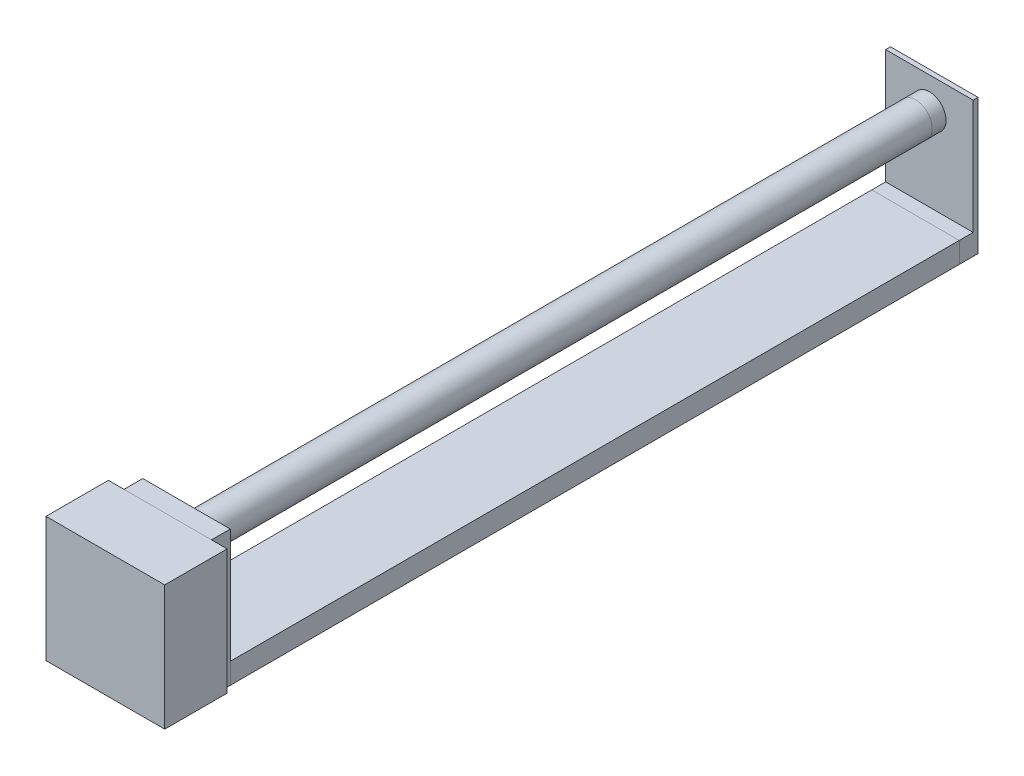
ISO-10303-21;
HEADER;
FILE_DESCRIPTION(('STEP AP214'),'2;1');
FILE_NAME('part.step','',(''),(''),'','','');
FILE_SCHEMA(('AUTOMOTIVE_DESIGN { 1 0 10303 214 1 1 1 1 }'));
ENDSEC;
DATA;
#1=APPLICATION_CONTEXT('core data for automotive mechanical design processes');
#2=APPLICATION_PROTOCOL_DEFINITION('international standard','automotive_design',2000,#1);
#3=PRODUCT_CONTEXT('',#1,'mechanical');
#4=PRODUCT('Part','Part','',(#3));
#5=PRODUCT_RELATED_PRODUCT_CATEGORY('part','',(#4));
#6=PRODUCT_DEFINITION_FORMATION('','',#4);
#7=PRODUCT_DEFINITION_CONTEXT('part definition',#1,'design');
#8=PRODUCT_DEFINITION('design','',#6,#7);
#9=PRODUCT_DEFINITION_SHAPE('','',#8);
#10=(LENGTH_UNIT() NAMED_UNIT(*) SI_UNIT(.MILLI.,.METRE.));
#11=(NAMED_UNIT(*) PLANE_ANGLE_UNIT() SI_UNIT($,.RADIAN.));
#12=(NAMED_UNIT(*) SI_UNIT($,.STERADIAN.) SOLID_ANGLE_UNIT());
#13=UNCERTAINTY_MEASURE_WITH_UNIT(LENGTH_MEASURE(1.E-05),#10,'distance_accuracy_value','');
#14=(GEOMETRIC_REPRESENTATION_CONTEXT(3) GLOBAL_UNCERTAINTY_ASSIGNED_CONTEXT((#13)) GLOBAL_UNIT_ASSIGNED_CONTEXT((#10,
#11,#12)) REPRESENTATION_CONTEXT('',''));
#15=CARTESIAN_POINT('',(0.,0.,0.));
#16=DIRECTION('',(0.,0.,1.));
#17=DIRECTION('',(1.,0.,0.));
#18=AXIS2_PLACEMENT_3D('',#15,#16,#17);
#19=CARTESIAN_POINT('',(-6.3,-1.5,107.7));
#20=DIRECTION('',(-1.,0.,0.));
#21=DIRECTION('',(0.,0.,1.));
#22=AXIS2_PLACEMENT_3D('',#19,#20,#21);
#23=PLANE('',#22);
#24=DIRECTION('',(0.,1.,0.));
#25=VECTOR('',#24,1.);
#26=CARTESIAN_POINT('',(-6.3,-1.5,105.));
#27=LINE('',#26,#25);
#28=CARTESIAN_POINT('',(-6.3,-1.5,105.));
#29=VERTEX_POINT('',#28);
#30=CARTESIAN_POINT('',(-6.3,18.,105.));
#31=VERTEX_POINT('',#30);
#32=EDGE_CURVE('E116',#29,#31,#27,.T.);
#33=ORIENTED_EDGE('',*,*,#32,.F.);
#34=DIRECTION('',(0.,0.,-1.));
#35=VECTOR('',#34,1.);
#36=CARTESIAN_POINT('',(-6.3,-1.5,107.7));
#37=LINE('',#36,#35);
#38=CARTESIAN_POINT('',(-6.3,-1.5,107.7));
#39=VERTEX_POINT('',#38);
#40=EDGE_CURVE('E12',#39,#29,#37,.T.);
#41=ORIENTED_EDGE('',*,*,#40,.F.);
#42=DIRECTION('',(0.,1.,0.));
#43=VECTOR('',#42,1.);
#44=CARTESIAN_POINT('',(-6.3,-1.5,107.7));
#45=LINE('',#44,#43);
#46=CARTESIAN_POINT('',(-6.3,18.,107.7));
#47=VERTEX_POINT('',#46);
#48=EDGE_CURVE('E111',#39,#47,#45,.T.);
#49=ORIENTED_EDGE('',*,*,#48,.T.);
#50=DIRECTION('',(0.,0.,-1.));
#51=VECTOR('',#50,1.);
#52=CARTESIAN_POINT('',(-6.3,18.,107.7));
#53=LINE('',#52,#51);
#54=EDGE_CURVE('E54',#47,#31,#53,.T.);
#55=ORIENTED_EDGE('',*,*,#54,.T.);
#56=EDGE_LOOP('',(#33,#41,#49,#55));
#57=FACE_BOUND('',#56,.T.);
#58=ADVANCED_FACE('F51',(#57),#23,.T.);
#59=CARTESIAN_POINT('',(-6.3,-1.5,107.7));
#60=DIRECTION('',(0.,1.,0.));
#61=DIRECTION('',(0.,0.,1.));
#62=AXIS2_PLACEMENT_3D('',#59,#60,#61);
#63=PLANE('',#62);
#64=DIRECTION('',(1.,0.,0.));
#65=VECTOR('',#64,1.);
#66=CARTESIAN_POINT('',(-6.3,-1.5,105.));
#67=LINE('',#66,#65);
#68=CARTESIAN_POINT('',(6.3,-1.5,105.));
#69=VERTEX_POINT('',#68);
#70=EDGE_CURVE('E84',#29,#69,#67,.T.);
#71=ORIENTED_EDGE('',*,*,#70,.T.);
#72=DIRECTION('',(0.,0.,-1.));
#73=VECTOR('',#72,1.);
#74=CARTESIAN_POINT('',(6.3,-1.5,107.7));
#75=LINE('',#74,#73);
#76=CARTESIAN_POINT('',(6.3,-1.5,107.7));
#77=VERTEX_POINT('',#76);
#78=EDGE_CURVE('E60',#77,#69,#75,.T.);
#79=ORIENTED_EDGE('',*,*,#78,.F.);
#80=DIRECTION('',(1.,0.,0.));
#81=VECTOR('',#80,1.);
#82=CARTESIAN_POINT('',(-6.3,-1.5,107.7));
#83=LINE('',#82,#81);
#84=EDGE_CURVE('E101',#39,#77,#83,.T.);
#85=ORIENTED_EDGE('',*,*,#84,.F.);
#86=ORIENTED_EDGE('',*,*,#40,.T.);
#87=EDGE_LOOP('',(#71,#79,#85,#86));
#88=FACE_BOUND('',#87,.T.);
#89=ADVANCED_FACE('F126',(#88),#63,.F.);
#90=CARTESIAN_POINT('',(6.3,-1.5,107.7));
#91=DIRECTION('',(-1.,0.,0.));
#92=DIRECTION('',(0.,0.,1.));
#93=AXIS2_PLACEMENT_3D('',#90,#91,#92);
#94=PLANE('',#93);
#95=DIRECTION('',(0.,1.,0.));
#96=VECTOR('',#95,1.);
#97=CARTESIAN_POINT('',(6.3,-1.5,105.));
#98=LINE('',#97,#96);
#99=CARTESIAN_POINT('',(6.3,18.,105.));
#100=VERTEX_POINT('',#99);
#101=EDGE_CURVE('E108',#69,#100,#98,.T.);
#102=ORIENTED_EDGE('',*,*,#101,.T.);
#103=DIRECTION('',(0.,0.,-1.));
#104=VECTOR('',#103,1.);
#105=CARTESIAN_POINT('',(6.3,18.,107.7));
#106=LINE('',#105,#104);
#107=CARTESIAN_POINT('',(6.3,18.,107.7));
#108=VERTEX_POINT('',#107);
#109=EDGE_CURVE('E105',#108,#100,#106,.T.);
#110=ORIENTED_EDGE('',*,*,#109,.F.);
#111=DIRECTION('',(0.,1.,0.));
#112=VECTOR('',#111,1.);
#113=CARTESIAN_POINT('',(6.3,-1.5,107.7));
#114=LINE('',#113,#112);
#115=EDGE_CURVE('E96',#77,#108,#114,.T.);
#116=ORIENTED_EDGE('',*,*,#115,.F.);
#117=ORIENTED_EDGE('',*,*,#78,.T.);
#118=EDGE_LOOP('',(#102,#110,#116,#117));
#119=FACE_BOUND('',#118,.T.);
#120=ADVANCED_FACE('F106',(#119),#94,.F.);
#121=CARTESIAN_POINT('',(-6.3,18.,107.7));
#122=DIRECTION('',(0.,1.,0.));
#123=DIRECTION('',(0.,0.,1.));
#124=AXIS2_PLACEMENT_3D('',#121,#122,#123);
#125=PLANE('',#124);
#126=DIRECTION('',(1.,0.,0.));
#127=VECTOR('',#126,1.);
#128=CARTESIAN_POINT('',(-6.3,18.,105.));
#129=LINE('',#128,#127);
#130=EDGE_CURVE('E119',#31,#100,#129,.T.);
#131=ORIENTED_EDGE('',*,*,#130,.F.);
#132=ORIENTED_EDGE('',*,*,#54,.F.);
#133=DIRECTION('',(1.,0.,0.));
#134=VECTOR('',#133,1.);
#135=CARTESIAN_POINT('',(-6.3,18.,107.7));
#136=LINE('',#135,#134);
#137=EDGE_CURVE('E100',#47,#108,#136,.T.);
#138=ORIENTED_EDGE('',*,*,#137,.T.);
#139=ORIENTED_EDGE('',*,*,#109,.T.);
#140=EDGE_LOOP('',(#131,#132,#138,#139));
#141=FACE_BOUND('',#140,.T.);
#142=ADVANCED_FACE('F110',(#141),#125,.T.);
#143=CARTESIAN_POINT('',(0.,0.,107.7));
#144=DIRECTION('',(0.,0.,-1.));
#145=DIRECTION('',(-1.,0.,0.));
#146=AXIS2_PLACEMENT_3D('',#143,#144,#145);
#147=PLANE('',#146);
#148=ORIENTED_EDGE('',*,*,#48,.F.);
#149=ORIENTED_EDGE('',*,*,#84,.T.);
#150=ORIENTED_EDGE('',*,*,#115,.T.);
#151=ORIENTED_EDGE('',*,*,#137,.F.);
#152=EDGE_LOOP('',(#148,#149,#150,#151));
#153=FACE_BOUND('',#152,.T.);
#154=ADVANCED_FACE('F99',(#153),#147,.F.);
#155=CARTESIAN_POINT('',(0.,0.,105.));
#156=DIRECTION('',(0.,0.,-1.));
#157=DIRECTION('',(-1.,0.,0.));
#158=AXIS2_PLACEMENT_3D('',#155,#156,#157);
#159=PLANE('',#158);
#160=ORIENTED_EDGE('',*,*,#32,.T.);
#161=ORIENTED_EDGE('',*,*,#130,.T.);
#162=ORIENTED_EDGE('',*,*,#101,.F.);
#163=ORIENTED_EDGE('',*,*,#70,.F.);
#164=EDGE_LOOP('',(#160,#161,#162,#163));
#165=FACE_BOUND('',#164,.T.);
#166=ADVANCED_FACE('F124',(#165),#159,.T.);
#167=CLOSED_SHELL('',(#58,#89,#120,#142,#154,#166));
#168=MANIFOLD_SOLID_BREP('B2',#167);
#169=CARTESIAN_POINT('',(6.3,18.,-2.7));
#170=DIRECTION('',(0.,-1.,0.));
#171=DIRECTION('',(0.,0.,-1.));
#172=AXIS2_PLACEMENT_3D('',#169,#170,#171);
#173=PLANE('',#172);
#174=DIRECTION('',(-1.,0.,0.));
#175=VECTOR('',#174,1.);
#176=CARTESIAN_POINT('',(-6.3,18.,-2.));
#177=LINE('',#176,#175);
#178=CARTESIAN_POINT('',(6.3,18.,-2.));
#179=VERTEX_POINT('',#178);
#180=CARTESIAN_POINT('',(-6.3,18.,-2.));
#181=VERTEX_POINT('',#180);
#182=EDGE_CURVE('E255',#179,#181,#177,.T.);
#183=ORIENTED_EDGE('',*,*,#182,.F.);
#184=DIRECTION('',(0.,0.,1.));
#185=VECTOR('',#184,1.);
#186=CARTESIAN_POINT('',(6.3,18.,-2.7));
#187=LINE('',#186,#185);
#188=CARTESIAN_POINT('',(6.3,18.,-2.7));
#189=VERTEX_POINT('',#188);
#190=EDGE_CURVE('E277',#189,#179,#187,.T.);
#191=ORIENTED_EDGE('',*,*,#190,.F.);
#192=DIRECTION('',(1.,0.,0.));
#193=VECTOR('',#192,1.);
#194=CARTESIAN_POINT('',(6.3,18.,-2.7));
#195=LINE('',#194,#193);
#196=CARTESIAN_POINT('',(-6.3,18.,-2.7));
#197=VERTEX_POINT('',#196);
#198=EDGE_CURVE('E208',#197,#189,#195,.T.);
#199=ORIENTED_EDGE('',*,*,#198,.F.);
#200=DIRECTION('',(0.,0.,1.));
#201=VECTOR('',#200,1.);
#202=CARTESIAN_POINT('',(-6.3,18.,-2.7));
#203=LINE('',#202,#201);
#204=EDGE_CURVE('E283',#197,#181,#203,.T.);
#205=ORIENTED_EDGE('',*,*,#204,.T.);
#206=EDGE_LOOP('',(#183,#191,#199,#205));
#207=FACE_BOUND('',#206,.T.);
#208=ADVANCED_FACE('F184',(#207),#173,.F.);
#209=CARTESIAN_POINT('',(6.3,-1.5,-2.7));
#210=DIRECTION('',(-1.,0.,0.));
#211=DIRECTION('',(0.,0.,1.));
#212=AXIS2_PLACEMENT_3D('',#209,#210,#211);
#213=PLANE('',#212);
#214=DIRECTION('',(0.,1.,0.));
#215=VECTOR('',#214,1.);
#216=CARTESIAN_POINT('',(6.3,18.,-2.));
#217=LINE('',#216,#215);
#218=CARTESIAN_POINT('',(6.3,1.5,-2.));
#219=VERTEX_POINT('',#218);
#220=EDGE_CURVE('E249',#219,#179,#217,.T.);
#221=ORIENTED_EDGE('',*,*,#220,.F.);
#222=DIRECTION('',(0.,0.,1.));
#223=VECTOR('',#222,1.);
#224=CARTESIAN_POINT('',(6.3,1.5,-2.));
#225=LINE('',#224,#223);
#226=CARTESIAN_POINT('',(6.3,1.5,0.));
#227=VERTEX_POINT('',#226);
#228=EDGE_CURVE('E246',#219,#227,#225,.T.);
#229=ORIENTED_EDGE('',*,*,#228,.T.);
#230=DIRECTION('',(0.,-1.,0.));
#231=VECTOR('',#230,1.);
#232=CARTESIAN_POINT('',(6.3,-1.5,0.));
#233=LINE('',#232,#231);
#234=CARTESIAN_POINT('',(6.3,-1.5,0.));
#235=VERTEX_POINT('',#234);
#236=EDGE_CURVE('E266',#227,#235,#233,.T.);
#237=ORIENTED_EDGE('',*,*,#236,.T.);
#238=DIRECTION('',(0.,0.,1.));
#239=VECTOR('',#238,1.);
#240=CARTESIAN_POINT('',(6.3,-1.5,-2.7));
#241=LINE('',#240,#239);
#242=CARTESIAN_POINT('',(6.3,-1.5,-2.7));
#243=VERTEX_POINT('',#242);
#244=EDGE_CURVE('E49',#243,#235,#241,.T.);
#245=ORIENTED_EDGE('',*,*,#244,.F.);
#246=DIRECTION('',(0.,-1.,0.));
#247=VECTOR('',#246,1.);
#248=CARTESIAN_POINT('',(6.3,-1.5,-2.7));
#249=LINE('',#248,#247);
#250=EDGE_CURVE('E271',#189,#243,#249,.T.);
#251=ORIENTED_EDGE('',*,*,#250,.F.);
#252=ORIENTED_EDGE('',*,*,#190,.T.);
#253=EDGE_LOOP('',(#221,#229,#237,#245,#251,#252));
#254=FACE_BOUND('',#253,.T.);
#255=ADVANCED_FACE('F186',(#254),#213,.F.);
#256=CARTESIAN_POINT('',(6.3,-1.5,-2.7));
#257=DIRECTION('',(0.,1.,0.));
#258=DIRECTION('',(0.,0.,1.));
#259=AXIS2_PLACEMENT_3D('',#256,#257,#258);
#260=PLANE('',#259);
#261=DIRECTION('',(-1.,0.,0.));
#262=VECTOR('',#261,1.);
#263=CARTESIAN_POINT('',(6.3,-1.5,0.));
#264=LINE('',#263,#262);
#265=CARTESIAN_POINT('',(-6.3,-1.5,0.));
#266=VERTEX_POINT('',#265);
#267=EDGE_CURVE('E223',#235,#266,#264,.T.);
#268=ORIENTED_EDGE('',*,*,#267,.T.);
#269=DIRECTION('',(0.,0.,1.));
#270=VECTOR('',#269,1.);
#271=CARTESIAN_POINT('',(-6.3,-1.5,-2.7));
#272=LINE('',#271,#270);
#273=CARTESIAN_POINT('',(-6.3,-1.5,-2.7));
#274=VERTEX_POINT('',#273);
#275=EDGE_CURVE('E192',#274,#266,#272,.T.);
#276=ORIENTED_EDGE('',*,*,#275,.F.);
#277=DIRECTION('',(-1.,0.,0.));
#278=VECTOR('',#277,1.);
#279=CARTESIAN_POINT('',(6.3,-1.5,-2.7));
#280=LINE('',#279,#278);
#281=EDGE_CURVE('E228',#243,#274,#280,.T.);
#282=ORIENTED_EDGE('',*,*,#281,.F.);
#283=ORIENTED_EDGE('',*,*,#244,.T.);
#284=EDGE_LOOP('',(#268,#276,#282,#283));
#285=FACE_BOUND('',#284,.T.);
#286=ADVANCED_FACE('F316',(#285),#260,.F.);
#287=CARTESIAN_POINT('',(-6.3,-1.5,-2.7));
#288=DIRECTION('',(1.,0.,0.));
#289=DIRECTION('',(0.,0.,-1.));
#290=AXIS2_PLACEMENT_3D('',#287,#288,#289);
#291=PLANE('',#290);
#292=DIRECTION('',(0.,1.,0.));
#293=VECTOR('',#292,1.);
#294=CARTESIAN_POINT('',(-6.3,-1.5,0.));
#295=LINE('',#294,#293);
#296=CARTESIAN_POINT('',(-6.3,1.5,0.));
#297=VERTEX_POINT('',#296);
#298=EDGE_CURVE('E264',#266,#297,#295,.T.);
#299=ORIENTED_EDGE('',*,*,#298,.T.);
#300=DIRECTION('',(0.,0.,1.));
#301=VECTOR('',#300,1.);
#302=CARTESIAN_POINT('',(-6.3,1.5,-2.));
#303=LINE('',#302,#301);
#304=CARTESIAN_POINT('',(-6.3,1.5,-2.));
#305=VERTEX_POINT('',#304);
#306=EDGE_CURVE('E199',#305,#297,#303,.T.);
#307=ORIENTED_EDGE('',*,*,#306,.F.);
#308=DIRECTION('',(0.,-1.,0.));
#309=VECTOR('',#308,1.);
#310=CARTESIAN_POINT('',(-6.3,18.,-2.));
#311=LINE('',#310,#309);
#312=EDGE_CURVE('E250',#181,#305,#311,.T.);
#313=ORIENTED_EDGE('',*,*,#312,.F.);
#314=ORIENTED_EDGE('',*,*,#204,.F.);
#315=DIRECTION('',(0.,1.,0.));
#316=VECTOR('',#315,1.);
#317=CARTESIAN_POINT('',(-6.3,-1.5,-2.7));
#318=LINE('',#317,#316);
#319=EDGE_CURVE('E274',#274,#197,#318,.T.);
#320=ORIENTED_EDGE('',*,*,#319,.F.);
#321=ORIENTED_EDGE('',*,*,#275,.T.);
#322=EDGE_LOOP('',(#299,#307,#313,#314,#320,#321));
#323=FACE_BOUND('',#322,.T.);
#324=ADVANCED_FACE('F262',(#323),#291,.F.);
#325=CARTESIAN_POINT('',(0.,0.,-2.7));
#326=DIRECTION('',(0.,0.,1.));
#327=DIRECTION('',(1.,0.,0.));
#328=AXIS2_PLACEMENT_3D('',#325,#326,#327);
#329=PLANE('',#328);
#330=ORIENTED_EDGE('',*,*,#250,.T.);
#331=ORIENTED_EDGE('',*,*,#281,.T.);
#332=ORIENTED_EDGE('',*,*,#319,.T.);
#333=ORIENTED_EDGE('',*,*,#198,.T.);
#334=EDGE_LOOP('',(#330,#331,#332,#333));
#335=FACE_BOUND('',#334,.T.);
#336=ADVANCED_FACE('F321',(#335),#329,.F.);
#337=CARTESIAN_POINT('',(0.,0.,0.));
#338=DIRECTION('',(0.,0.,1.));
#339=DIRECTION('',(1.,0.,0.));
#340=AXIS2_PLACEMENT_3D('',#337,#338,#339);
#341=PLANE('',#340);
#342=DIRECTION('',(1.,0.,0.));
#343=VECTOR('',#342,1.);
#344=CARTESIAN_POINT('',(-6.3,1.5,0.));
#345=LINE('',#344,#343);
#346=EDGE_CURVE('E259',#297,#227,#345,.T.);
#347=ORIENTED_EDGE('',*,*,#346,.F.);
#348=ORIENTED_EDGE('',*,*,#298,.F.);
#349=ORIENTED_EDGE('',*,*,#267,.F.);
#350=ORIENTED_EDGE('',*,*,#236,.F.);
#351=EDGE_LOOP('',(#347,#348,#349,#350));
#352=FACE_BOUND('',#351,.T.);
#353=ADVANCED_FACE('F286',(#352),#341,.T.);
#354=CARTESIAN_POINT('',(-6.3,1.5,-2.));
#355=DIRECTION('',(0.,-1.,0.));
#356=DIRECTION('',(0.,0.,-1.));
#357=AXIS2_PLACEMENT_3D('',#354,#355,#356);
#358=PLANE('',#357);
#359=ORIENTED_EDGE('',*,*,#346,.T.);
#360=ORIENTED_EDGE('',*,*,#228,.F.);
#361=DIRECTION('',(1.,0.,0.));
#362=VECTOR('',#361,1.);
#363=CARTESIAN_POINT('',(-6.3,1.5,-2.));
#364=LINE('',#363,#362);
#365=EDGE_CURVE('E242',#305,#219,#364,.T.);
#366=ORIENTED_EDGE('',*,*,#365,.F.);
#367=ORIENTED_EDGE('',*,*,#306,.T.);
#368=EDGE_LOOP('',(#359,#360,#366,#367));
#369=FACE_BOUND('',#368,.T.);
#370=ADVANCED_FACE('F244',(#369),#358,.F.);
#371=CARTESIAN_POINT('',(0.,0.,-2.));
#372=DIRECTION('',(0.,0.,1.));
#373=DIRECTION('',(1.,0.,0.));
#374=AXIS2_PLACEMENT_3D('',#371,#372,#373);
#375=PLANE('',#374);
#376=CARTESIAN_POINT('',(0.,13.5,-2.));
#377=DIRECTION('',(0.,0.,1.));
#378=DIRECTION('',(1.,0.,0.));
#379=AXIS2_PLACEMENT_3D('',#376,#377,#378);
#380=CIRCLE('',#379,2.4);
#381=CARTESIAN_POINT('',(2.4,13.5,-2.));
#382=VERTEX_POINT('',#381);
#383=EDGE_CURVE('E288',#382,#382,#380,.T.);
#384=ORIENTED_EDGE('',*,*,#383,.F.);
#385=EDGE_LOOP('',(#384));
#386=FACE_BOUND('',#385,.T.);
#387=ORIENTED_EDGE('',*,*,#312,.T.);
#388=ORIENTED_EDGE('',*,*,#365,.T.);
#389=ORIENTED_EDGE('',*,*,#220,.T.);
#390=ORIENTED_EDGE('',*,*,#182,.T.);
#391=EDGE_LOOP('',(#387,#388,#389,#390));
#392=FACE_BOUND('',#391,.T.);
#393=ADVANCED_FACE('F253',(#386,#392),#375,.T.);
#394=CARTESIAN_POINT('',(0.,13.5,-2.));
#395=DIRECTION('',(0.,0.,1.));
#396=DIRECTION('',(1.,0.,0.));
#397=AXIS2_PLACEMENT_3D('',#394,#395,#396);
#398=CYLINDRICAL_SURFACE('',#397,2.4);
#399=ORIENTED_EDGE('',*,*,#383,.T.);
#400=EDGE_LOOP('',(#399));
#401=FACE_BOUND('',#400,.T.);
#402=CARTESIAN_POINT('',(0.,13.5,0.));
#403=DIRECTION('',(0.,0.,1.));
#404=DIRECTION('',(1.,0.,0.));
#405=AXIS2_PLACEMENT_3D('',#402,#403,#404);
#406=CIRCLE('',#405,2.4);
#407=CARTESIAN_POINT('',(2.4,13.5,0.));
#408=VERTEX_POINT('',#407);
#409=EDGE_CURVE('E290',#408,#408,#406,.T.);
#410=ORIENTED_EDGE('',*,*,#409,.F.);
#411=EDGE_LOOP('',(#410));
#412=FACE_BOUND('',#411,.T.);
#413=ADVANCED_FACE('F299',(#401,#412),#398,.T.);
#414=ORIENTED_EDGE('',*,*,#409,.T.);
#415=EDGE_LOOP('',(#414));
#416=FACE_BOUND('',#415,.T.);
#417=ADVANCED_FACE('F297',(#416),#341,.T.);
#418=CLOSED_SHELL('',(#208,#255,#286,#324,#336,#353,#370,#393,#413,#417));
#419=MANIFOLD_SOLID_BREP('B6',#418);
#420=CARTESIAN_POINT('',(-8.55,18.,124.5));
#421=DIRECTION('',(1.,0.,0.));
#422=DIRECTION('',(0.,1.,0.));
#423=AXIS2_PLACEMENT_3D('',#420,#421,#422);
#424=PLANE('',#423);
#425=DIRECTION('',(0.,0.,-1.));
#426=VECTOR('',#425,1.);
#427=CARTESIAN_POINT('',(-8.55,0.,124.5));
#428=LINE('',#427,#426);
#429=CARTESIAN_POINT('',(-8.55,0.,116.688841177387));
#430=VERTEX_POINT('',#429);
#431=CARTESIAN_POINT('',(-8.55,0.,107.7));
#432=VERTEX_POINT('',#431);
#433=EDGE_CURVE('E182',#430,#432,#428,.T.);
#434=ORIENTED_EDGE('',*,*,#433,.F.);
#435=DIRECTION('',(0.,1.,0.));
#436=VECTOR('',#435,1.);
#437=CARTESIAN_POINT('',(-8.55,18.,116.688841177387));
#438=LINE('',#437,#436);
#439=CARTESIAN_POINT('',(-8.55,18.,116.688841177387));
#440=VERTEX_POINT('',#439);
#441=EDGE_CURVE('E436',#430,#440,#438,.T.);
#442=ORIENTED_EDGE('',*,*,#441,.T.);
#443=DIRECTION('',(0.,0.,-1.));
#444=VECTOR('',#443,1.);
#445=CARTESIAN_POINT('',(-8.55,18.,124.5));
#446=LINE('',#445,#444);
#447=CARTESIAN_POINT('',(-8.55,18.,107.7));
#448=VERTEX_POINT('',#447);
#449=EDGE_CURVE('E418',#440,#448,#446,.T.);
#450=ORIENTED_EDGE('',*,*,#449,.T.);
#451=DIRECTION('',(0.,-1.,0.));
#452=VECTOR('',#451,1.);
#453=CARTESIAN_POINT('',(-8.55,18.,107.7));
#454=LINE('',#453,#452);
#455=EDGE_CURVE('E442',#448,#432,#454,.T.);
#456=ORIENTED_EDGE('',*,*,#455,.T.);
#457=EDGE_LOOP('',(#434,#442,#450,#456));
#458=FACE_BOUND('',#457,.T.);
#459=ADVANCED_FACE('F396',(#458),#424,.F.);
#460=CARTESIAN_POINT('',(-8.55,0.,124.5));
#461=DIRECTION('',(0.,1.,0.));
#462=DIRECTION('',(0.,0.,1.));
#463=AXIS2_PLACEMENT_3D('',#460,#461,#462);
#464=PLANE('',#463);
#465=DIRECTION('',(0.,0.,-1.));
#466=VECTOR('',#465,1.);
#467=CARTESIAN_POINT('',(8.55,0.,124.5));
#468=LINE('',#467,#466);
#469=CARTESIAN_POINT('',(8.55,0.,116.688841177387));
#470=VERTEX_POINT('',#469);
#471=CARTESIAN_POINT('',(8.55,0.,107.7));
#472=VERTEX_POINT('',#471);
#473=EDGE_CURVE('E403',#470,#472,#468,.T.);
#474=ORIENTED_EDGE('',*,*,#473,.F.);
#475=DIRECTION('',(-1.,0.,0.));
#476=VECTOR('',#475,1.);
#477=CARTESIAN_POINT('',(-8.55,0.,116.688841177387));
#478=LINE('',#477,#476);
#479=EDGE_CURVE('E443',#470,#430,#478,.T.);
#480=ORIENTED_EDGE('',*,*,#479,.T.);
#481=ORIENTED_EDGE('',*,*,#433,.T.);
#482=DIRECTION('',(1.,0.,0.));
#483=VECTOR('',#482,1.);
#484=CARTESIAN_POINT('',(-8.55,0.,107.7));
#485=LINE('',#484,#483);
#486=EDGE_CURVE('E463',#432,#472,#485,.T.);
#487=ORIENTED_EDGE('',*,*,#486,.T.);
#488=EDGE_LOOP('',(#474,#480,#481,#487));
#489=FACE_BOUND('',#488,.T.);
#490=ADVANCED_FACE('F464',(#489),#464,.F.);
#491=CARTESIAN_POINT('',(8.55,18.,124.5));
#492=DIRECTION('',(-1.,0.,0.));
#493=DIRECTION('',(0.,-1.,0.));
#494=AXIS2_PLACEMENT_3D('',#491,#492,#493);
#495=PLANE('',#494);
#496=DIRECTION('',(0.,0.,-1.));
#497=VECTOR('',#496,1.);
#498=CARTESIAN_POINT('',(8.55,18.,124.5));
#499=LINE('',#498,#497);
#500=CARTESIAN_POINT('',(8.55,18.,116.688841177387));
#501=VERTEX_POINT('',#500);
#502=CARTESIAN_POINT('',(8.55,18.,107.7));
#503=VERTEX_POINT('',#502);
#504=EDGE_CURVE('E449',#501,#503,#499,.T.);
#505=ORIENTED_EDGE('',*,*,#504,.F.);
#506=DIRECTION('',(0.,-1.,0.));
#507=VECTOR('',#506,1.);
#508=CARTESIAN_POINT('',(8.55,18.,116.688841177387));
#509=LINE('',#508,#507);
#510=EDGE_CURVE('E410',#501,#470,#509,.T.);
#511=ORIENTED_EDGE('',*,*,#510,.T.);
#512=ORIENTED_EDGE('',*,*,#473,.T.);
#513=DIRECTION('',(0.,1.,0.));
#514=VECTOR('',#513,1.);
#515=CARTESIAN_POINT('',(8.55,18.,107.7));
#516=LINE('',#515,#514);
#517=EDGE_CURVE('E452',#472,#503,#516,.T.);
#518=ORIENTED_EDGE('',*,*,#517,.T.);
#519=EDGE_LOOP('',(#505,#511,#512,#518));
#520=FACE_BOUND('',#519,.T.);
#521=ADVANCED_FACE('F459',(#520),#495,.F.);
#522=CARTESIAN_POINT('',(-8.55,18.,124.5));
#523=DIRECTION('',(0.,-1.,0.));
#524=DIRECTION('',(0.,0.,-1.));
#525=AXIS2_PLACEMENT_3D('',#522,#523,#524);
#526=PLANE('',#525);
#527=ORIENTED_EDGE('',*,*,#449,.F.);
#528=DIRECTION('',(-1.,0.,0.));
#529=VECTOR('',#528,1.);
#530=CARTESIAN_POINT('',(-19.1661664044896,18.,116.688841177387));
#531=LINE('',#530,#529);
#532=EDGE_CURVE('E434',#501,#440,#531,.T.);
#533=ORIENTED_EDGE('',*,*,#532,.F.);
#534=ORIENTED_EDGE('',*,*,#504,.T.);
#535=DIRECTION('',(-1.,0.,0.));
#536=VECTOR('',#535,1.);
#537=CARTESIAN_POINT('',(-8.55,18.,107.7));
#538=LINE('',#537,#536);
#539=EDGE_CURVE('E447',#503,#448,#538,.T.);
#540=ORIENTED_EDGE('',*,*,#539,.T.);
#541=EDGE_LOOP('',(#527,#533,#534,#540));
#542=FACE_BOUND('',#541,.T.);
#543=ADVANCED_FACE('F445',(#542),#526,.F.);
#544=CARTESIAN_POINT('',(0.,0.,107.7));
#545=DIRECTION('',(0.,0.,1.));
#546=DIRECTION('',(1.,0.,0.));
#547=AXIS2_PLACEMENT_3D('',#544,#545,#546);
#548=PLANE('',#547);
#549=ORIENTED_EDGE('',*,*,#455,.F.);
#550=ORIENTED_EDGE('',*,*,#539,.F.);
#551=ORIENTED_EDGE('',*,*,#517,.F.);
#552=ORIENTED_EDGE('',*,*,#486,.F.);
#553=EDGE_LOOP('',(#549,#550,#551,#552));
#554=FACE_BOUND('',#553,.T.);
#555=ADVANCED_FACE('F467',(#554),#548,.F.);
#556=CARTESIAN_POINT('',(-19.1661664044896,-12.,116.688841177387));
#557=DIRECTION('',(0.,0.,-1.));
#558=DIRECTION('',(-1.,0.,0.));
#559=AXIS2_PLACEMENT_3D('',#556,#557,#558);
#560=PLANE('',#559);
#561=ORIENTED_EDGE('',*,*,#479,.F.);
#562=ORIENTED_EDGE('',*,*,#510,.F.);
#563=ORIENTED_EDGE('',*,*,#532,.T.);
#564=ORIENTED_EDGE('',*,*,#441,.F.);
#565=EDGE_LOOP('',(#561,#562,#563,#564));
#566=FACE_BOUND('',#565,.T.);
#567=ADVANCED_FACE('F435',(#566),#560,.F.);
#568=CLOSED_SHELL('',(#459,#490,#521,#543,#555,#567));
#569=MANIFOLD_SOLID_BREP('B43',#568);
#570=CARTESIAN_POINT('',(0.,13.5,0.));
#571=DIRECTION('',(0.,0.,1.));
#572=DIRECTION('',(1.,0.,0.));
#573=AXIS2_PLACEMENT_3D('',#570,#571,#572);
#574=PLANE('',#573);
#575=CARTESIAN_POINT('',(0.,13.5,0.));
#576=DIRECTION('',(0.,0.,1.));
#577=DIRECTION('',(1.,0.,0.));
#578=AXIS2_PLACEMENT_3D('',#575,#576,#577);
#579=CIRCLE('',#578,2.4);
#580=CARTESIAN_POINT('',(2.4,13.5,0.));
#581=VERTEX_POINT('',#580);
#582=EDGE_CURVE('E535',#581,#581,#579,.T.);
#583=ORIENTED_EDGE('',*,*,#582,.F.);
#584=EDGE_LOOP('',(#583));
#585=FACE_BOUND('',#584,.T.);
#586=ADVANCED_FACE('F528',(#585),#574,.F.);
#587=CARTESIAN_POINT('',(0.,13.5,111.788225099391));
#588=DIRECTION('',(0.,0.,-1.));
#589=DIRECTION('',(-1.,0.,0.));
#590=AXIS2_PLACEMENT_3D('',#587,#588,#589);
#591=CYLINDRICAL_SURFACE('',#590,2.4);
#592=CARTESIAN_POINT('',(0.,13.5,105.));
#593=DIRECTION('',(0.,0.,-1.));
#594=DIRECTION('',(-1.,0.,0.));
#595=AXIS2_PLACEMENT_3D('',#592,#593,#594);
#596=CIRCLE('',#595,2.4);
#597=CARTESIAN_POINT('',(-2.4,13.5,105.));
#598=VERTEX_POINT('',#597);
#599=EDGE_CURVE('E395',#598,#598,#596,.T.);
#600=ORIENTED_EDGE('',*,*,#599,.T.);
#601=EDGE_LOOP('',(#600));
#602=FACE_BOUND('',#601,.T.);
#603=ORIENTED_EDGE('',*,*,#582,.T.);
#604=EDGE_LOOP('',(#603));
#605=FACE_BOUND('',#604,.T.);
#606=ADVANCED_FACE('F530',(#602,#605),#591,.T.);
#607=CARTESIAN_POINT('',(0.,0.,105.));
#608=DIRECTION('',(0.,0.,-1.));
#609=DIRECTION('',(-1.,0.,0.));
#610=AXIS2_PLACEMENT_3D('',#607,#608,#609);
#611=PLANE('',#610);
#612=ORIENTED_EDGE('',*,*,#599,.F.);
#613=EDGE_LOOP('',(#612));
#614=FACE_BOUND('',#613,.T.);
#615=ADVANCED_FACE('F546',(#614),#611,.F.);
#616=CLOSED_SHELL('',(#586,#606,#615));
#617=MANIFOLD_SOLID_BREP('B176',#616);
#618=CARTESIAN_POINT('',(-6.3,-1.5,105.));
#619=DIRECTION('',(1.,0.,0.));
#620=DIRECTION('',(0.,0.,-1.));
#621=AXIS2_PLACEMENT_3D('',#618,#619,#620);
#622=PLANE('',#621);
#623=DIRECTION('',(0.,-1.,0.));
#624=VECTOR('',#623,1.);
#625=CARTESIAN_POINT('',(-6.3,-1.5,0.));
#626=LINE('',#625,#624);
#627=CARTESIAN_POINT('',(-6.3,1.5,0.));
#628=VERTEX_POINT('',#627);
#629=CARTESIAN_POINT('',(-6.3,-1.5,0.));
#630=VERTEX_POINT('',#629);
#631=EDGE_CURVE('E631',#628,#630,#626,.T.);
#632=ORIENTED_EDGE('',*,*,#631,.T.);
#633=DIRECTION('',(0.,0.,-1.));
#634=VECTOR('',#633,1.);
#635=CARTESIAN_POINT('',(-6.3,-1.5,105.));
#636=LINE('',#635,#634);
#637=CARTESIAN_POINT('',(-6.3,-1.5,105.));
#638=VERTEX_POINT('',#637);
#639=EDGE_CURVE('E526',#638,#630,#636,.T.);
#640=ORIENTED_EDGE('',*,*,#639,.F.);
#641=DIRECTION('',(0.,-1.,0.));
#642=VECTOR('',#641,1.);
#643=CARTESIAN_POINT('',(-6.3,-1.5,105.));
#644=LINE('',#643,#642);
#645=CARTESIAN_POINT('',(-6.3,1.5,105.));
#646=VERTEX_POINT('',#645);
#647=EDGE_CURVE('E619',#646,#638,#644,.T.);
#648=ORIENTED_EDGE('',*,*,#647,.F.);
#649=DIRECTION('',(0.,0.,-1.));
#650=VECTOR('',#649,1.);
#651=CARTESIAN_POINT('',(-6.3,1.5,105.));
#652=LINE('',#651,#650);
#653=EDGE_CURVE('E627',#646,#628,#652,.T.);
#654=ORIENTED_EDGE('',*,*,#653,.T.);
#655=EDGE_LOOP('',(#632,#640,#648,#654));
#656=FACE_BOUND('',#655,.T.);
#657=ADVANCED_FACE('F568',(#656),#622,.F.);
#658=CARTESIAN_POINT('',(6.3,-1.5,105.));
#659=DIRECTION('',(0.,1.,0.));
#660=DIRECTION('',(-1.,0.,0.));
#661=AXIS2_PLACEMENT_3D('',#658,#659,#660);
#662=PLANE('',#661);
#663=DIRECTION('',(1.,0.,0.));
#664=VECTOR('',#663,1.);
#665=CARTESIAN_POINT('',(6.3,-1.5,0.));
#666=LINE('',#665,#664);
#667=CARTESIAN_POINT('',(6.3,-1.5,0.));
#668=VERTEX_POINT('',#667);
#669=EDGE_CURVE('E623',#630,#668,#666,.T.);
#670=ORIENTED_EDGE('',*,*,#669,.T.);
#671=DIRECTION('',(0.,0.,-1.));
#672=VECTOR('',#671,1.);
#673=CARTESIAN_POINT('',(6.3,-1.5,105.));
#674=LINE('',#673,#672);
#675=CARTESIAN_POINT('',(6.3,-1.5,105.));
#676=VERTEX_POINT('',#675);
#677=EDGE_CURVE('E576',#676,#668,#674,.T.);
#678=ORIENTED_EDGE('',*,*,#677,.F.);
#679=DIRECTION('',(1.,0.,0.));
#680=VECTOR('',#679,1.);
#681=CARTESIAN_POINT('',(6.3,-1.5,105.));
#682=LINE('',#681,#680);
#683=EDGE_CURVE('E614',#638,#676,#682,.T.);
#684=ORIENTED_EDGE('',*,*,#683,.F.);
#685=ORIENTED_EDGE('',*,*,#639,.T.);
#686=EDGE_LOOP('',(#670,#678,#684,#685));
#687=FACE_BOUND('',#686,.T.);
#688=ADVANCED_FACE('F622',(#687),#662,.F.);
#689=CARTESIAN_POINT('',(6.3,-1.5,105.));
#690=DIRECTION('',(-1.,0.,0.));
#691=DIRECTION('',(0.,0.,1.));
#692=AXIS2_PLACEMENT_3D('',#689,#690,#691);
#693=PLANE('',#692);
#694=DIRECTION('',(0.,1.,0.));
#695=VECTOR('',#694,1.);
#696=CARTESIAN_POINT('',(6.3,-1.5,0.));
#697=LINE('',#696,#695);
#698=CARTESIAN_POINT('',(6.3,1.5,0.));
#699=VERTEX_POINT('',#698);
#700=EDGE_CURVE('E601',#668,#699,#697,.T.);
#701=ORIENTED_EDGE('',*,*,#700,.T.);
#702=DIRECTION('',(0.,0.,-1.));
#703=VECTOR('',#702,1.);
#704=CARTESIAN_POINT('',(6.3,1.5,105.));
#705=LINE('',#704,#703);
#706=CARTESIAN_POINT('',(6.3,1.5,105.));
#707=VERTEX_POINT('',#706);
#708=EDGE_CURVE('E624',#707,#699,#705,.T.);
#709=ORIENTED_EDGE('',*,*,#708,.F.);
#710=DIRECTION('',(0.,1.,0.));
#711=VECTOR('',#710,1.);
#712=CARTESIAN_POINT('',(6.3,-1.5,105.));
#713=LINE('',#712,#711);
#714=EDGE_CURVE('E617',#676,#707,#713,.T.);
#715=ORIENTED_EDGE('',*,*,#714,.F.);
#716=ORIENTED_EDGE('',*,*,#677,.T.);
#717=EDGE_LOOP('',(#701,#709,#715,#716));
#718=FACE_BOUND('',#717,.T.);
#719=ADVANCED_FACE('F625',(#718),#693,.F.);
#720=CARTESIAN_POINT('',(6.3,1.5,105.));
#721=DIRECTION('',(0.,-1.,0.));
#722=DIRECTION('',(1.,0.,0.));
#723=AXIS2_PLACEMENT_3D('',#720,#721,#722);
#724=PLANE('',#723);
#725=DIRECTION('',(-1.,0.,0.));
#726=VECTOR('',#725,1.);
#727=CARTESIAN_POINT('',(6.3,1.5,0.));
#728=LINE('',#727,#726);
#729=EDGE_CURVE('E607',#699,#628,#728,.T.);
#730=ORIENTED_EDGE('',*,*,#729,.T.);
#731=ORIENTED_EDGE('',*,*,#653,.F.);
#732=DIRECTION('',(-1.,0.,0.));
#733=VECTOR('',#732,1.);
#734=CARTESIAN_POINT('',(6.3,1.5,105.));
#735=LINE('',#734,#733);
#736=EDGE_CURVE('E584',#707,#646,#735,.T.);
#737=ORIENTED_EDGE('',*,*,#736,.F.);
#738=ORIENTED_EDGE('',*,*,#708,.T.);
#739=EDGE_LOOP('',(#730,#731,#737,#738));
#740=FACE_BOUND('',#739,.T.);
#741=ADVANCED_FACE('F638',(#740),#724,.F.);
#742=CARTESIAN_POINT('',(0.,0.,105.));
#743=DIRECTION('',(0.,0.,1.));
#744=DIRECTION('',(1.,0.,0.));
#745=AXIS2_PLACEMENT_3D('',#742,#743,#744);
#746=PLANE('',#745);
#747=ORIENTED_EDGE('',*,*,#647,.T.);
#748=ORIENTED_EDGE('',*,*,#683,.T.);
#749=ORIENTED_EDGE('',*,*,#714,.T.);
#750=ORIENTED_EDGE('',*,*,#736,.T.);
#751=EDGE_LOOP('',(#747,#748,#749,#750));
#752=FACE_BOUND('',#751,.T.);
#753=ADVANCED_FACE('F615',(#752),#746,.T.);
#754=CARTESIAN_POINT('',(0.,0.,0.));
#755=DIRECTION('',(0.,0.,1.));
#756=DIRECTION('',(1.,0.,0.));
#757=AXIS2_PLACEMENT_3D('',#754,#755,#756);
#758=PLANE('',#757);
#759=ORIENTED_EDGE('',*,*,#631,.F.);
#760=ORIENTED_EDGE('',*,*,#729,.F.);
#761=ORIENTED_EDGE('',*,*,#700,.F.);
#762=ORIENTED_EDGE('',*,*,#669,.F.);
#763=EDGE_LOOP('',(#759,#760,#761,#762));
#764=FACE_BOUND('',#763,.T.);
#765=ADVANCED_FACE('F641',(#764),#758,.F.);
#766=CLOSED_SHELL('',(#657,#688,#719,#741,#753,#765));
#767=MANIFOLD_SOLID_BREP('B390',#766);
#768=ADVANCED_BREP_SHAPE_REPRESENTATION('',(#18,#168,#419,#569,#617,#767),#14);
#769=SHAPE_DEFINITION_REPRESENTATION(#9,#768);
ENDSEC;
END-ISO-10303-21;
